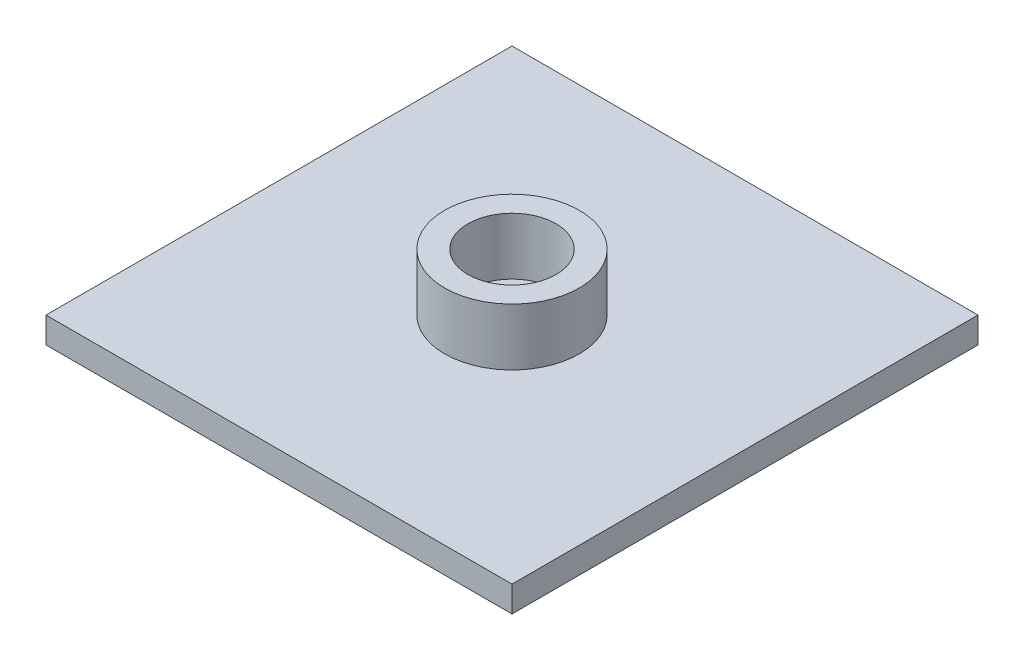
ISO-10303-21;
HEADER;
FILE_DESCRIPTION(('STEP AP214'),'2;1');
FILE_NAME('part.step','',(''),(''),'','','');
FILE_SCHEMA(('AUTOMOTIVE_DESIGN { 1 0 10303 214 1 1 1 1 }'));
ENDSEC;
DATA;
#1=APPLICATION_CONTEXT('core data for automotive mechanical design processes');
#2=APPLICATION_PROTOCOL_DEFINITION('international standard','automotive_design',2000,#1);
#3=PRODUCT_CONTEXT('',#1,'mechanical');
#4=PRODUCT('Part','Part','',(#3));
#5=PRODUCT_RELATED_PRODUCT_CATEGORY('part','',(#4));
#6=PRODUCT_DEFINITION_FORMATION('','',#4);
#7=PRODUCT_DEFINITION_CONTEXT('part definition',#1,'design');
#8=PRODUCT_DEFINITION('design','',#6,#7);
#9=PRODUCT_DEFINITION_SHAPE('','',#8);
#10=(LENGTH_UNIT() NAMED_UNIT(*) SI_UNIT(.MILLI.,.METRE.));
#11=(NAMED_UNIT(*) PLANE_ANGLE_UNIT() SI_UNIT($,.RADIAN.));
#12=(NAMED_UNIT(*) SI_UNIT($,.STERADIAN.) SOLID_ANGLE_UNIT());
#13=UNCERTAINTY_MEASURE_WITH_UNIT(LENGTH_MEASURE(1.E-05),#10,'distance_accuracy_value','');
#14=(GEOMETRIC_REPRESENTATION_CONTEXT(3) GLOBAL_UNCERTAINTY_ASSIGNED_CONTEXT((#13)) GLOBAL_UNIT_ASSIGNED_CONTEXT((#10,
#11,#12)) REPRESENTATION_CONTEXT('',''));
#15=CARTESIAN_POINT('',(0.,0.,0.));
#16=DIRECTION('',(0.,0.,1.));
#17=DIRECTION('',(1.,0.,0.));
#18=AXIS2_PLACEMENT_3D('',#15,#16,#17);
#19=CARTESIAN_POINT('',(0.,6.35,0.));
#20=DIRECTION('',(1.,0.,0.));
#21=DIRECTION('',(0.,0.,-1.));
#22=AXIS2_PLACEMENT_3D('',#19,#20,#21);
#23=PLANE('',#22);
#24=DIRECTION('',(0.,0.,1.));
#25=VECTOR('',#24,1.);
#26=CARTESIAN_POINT('',(0.,0.,0.));
#27=LINE('',#26,#25);
#28=CARTESIAN_POINT('',(0.,0.,-114.3));
#29=VERTEX_POINT('',#28);
#30=CARTESIAN_POINT('',(0.,0.,0.));
#31=VERTEX_POINT('',#30);
#32=EDGE_CURVE('E116',#29,#31,#27,.T.);
#33=ORIENTED_EDGE('',*,*,#32,.T.);
#34=DIRECTION('',(0.,-1.,0.));
#35=VECTOR('',#34,1.);
#36=CARTESIAN_POINT('',(0.,6.35,0.));
#37=LINE('',#36,#35);
#38=CARTESIAN_POINT('',(0.,6.35,0.));
#39=VERTEX_POINT('',#38);
#40=EDGE_CURVE('E48',#39,#31,#37,.T.);
#41=ORIENTED_EDGE('',*,*,#40,.F.);
#42=DIRECTION('',(0.,0.,1.));
#43=VECTOR('',#42,1.);
#44=CARTESIAN_POINT('',(0.,6.35,0.));
#45=LINE('',#44,#43);
#46=CARTESIAN_POINT('',(0.,6.35,-114.3));
#47=VERTEX_POINT('',#46);
#48=EDGE_CURVE('E99',#47,#39,#45,.T.);
#49=ORIENTED_EDGE('',*,*,#48,.F.);
#50=DIRECTION('',(0.,-1.,0.));
#51=VECTOR('',#50,1.);
#52=CARTESIAN_POINT('',(0.,6.35,-114.3));
#53=LINE('',#52,#51);
#54=EDGE_CURVE('E112',#47,#29,#53,.T.);
#55=ORIENTED_EDGE('',*,*,#54,.T.);
#56=EDGE_LOOP('',(#33,#41,#49,#55));
#57=FACE_BOUND('',#56,.T.);
#58=ADVANCED_FACE('F45',(#57),#23,.F.);
#59=CARTESIAN_POINT('',(0.,6.35,0.));
#60=DIRECTION('',(0.,0.,-1.));
#61=DIRECTION('',(-1.,0.,0.));
#62=AXIS2_PLACEMENT_3D('',#59,#60,#61);
#63=PLANE('',#62);
#64=DIRECTION('',(1.,0.,0.));
#65=VECTOR('',#64,1.);
#66=CARTESIAN_POINT('',(0.,0.,0.));
#67=LINE('',#66,#65);
#68=CARTESIAN_POINT('',(114.3,0.,0.));
#69=VERTEX_POINT('',#68);
#70=EDGE_CURVE('E105',#31,#69,#67,.T.);
#71=ORIENTED_EDGE('',*,*,#70,.T.);
#72=DIRECTION('',(0.,-1.,0.));
#73=VECTOR('',#72,1.);
#74=CARTESIAN_POINT('',(114.3,6.35,0.));
#75=LINE('',#74,#73);
#76=CARTESIAN_POINT('',(114.3,6.35,0.));
#77=VERTEX_POINT('',#76);
#78=EDGE_CURVE('E103',#77,#69,#75,.T.);
#79=ORIENTED_EDGE('',*,*,#78,.F.);
#80=DIRECTION('',(1.,0.,0.));
#81=VECTOR('',#80,1.);
#82=CARTESIAN_POINT('',(0.,6.35,0.));
#83=LINE('',#82,#81);
#84=EDGE_CURVE('E94',#39,#77,#83,.T.);
#85=ORIENTED_EDGE('',*,*,#84,.F.);
#86=ORIENTED_EDGE('',*,*,#40,.T.);
#87=EDGE_LOOP('',(#71,#79,#85,#86));
#88=FACE_BOUND('',#87,.T.);
#89=ADVANCED_FACE('F104',(#88),#63,.F.);
#90=CARTESIAN_POINT('',(114.3,6.35,0.));
#91=DIRECTION('',(-1.,0.,0.));
#92=DIRECTION('',(0.,0.,1.));
#93=AXIS2_PLACEMENT_3D('',#90,#91,#92);
#94=PLANE('',#93);
#95=DIRECTION('',(0.,0.,-1.));
#96=VECTOR('',#95,1.);
#97=CARTESIAN_POINT('',(114.3,0.,0.));
#98=LINE('',#97,#96);
#99=CARTESIAN_POINT('',(114.3,0.,-114.3));
#100=VERTEX_POINT('',#99);
#101=EDGE_CURVE('E80',#69,#100,#98,.T.);
#102=ORIENTED_EDGE('',*,*,#101,.T.);
#103=DIRECTION('',(0.,-1.,0.));
#104=VECTOR('',#103,1.);
#105=CARTESIAN_POINT('',(114.3,6.35,-114.3));
#106=LINE('',#105,#104);
#107=CARTESIAN_POINT('',(114.3,6.35,-114.3));
#108=VERTEX_POINT('',#107);
#109=EDGE_CURVE('E107',#108,#100,#106,.T.);
#110=ORIENTED_EDGE('',*,*,#109,.F.);
#111=DIRECTION('',(0.,0.,-1.));
#112=VECTOR('',#111,1.);
#113=CARTESIAN_POINT('',(114.3,6.35,0.));
#114=LINE('',#113,#112);
#115=EDGE_CURVE('E97',#77,#108,#114,.T.);
#116=ORIENTED_EDGE('',*,*,#115,.F.);
#117=ORIENTED_EDGE('',*,*,#78,.T.);
#118=EDGE_LOOP('',(#102,#110,#116,#117));
#119=FACE_BOUND('',#118,.T.);
#120=ADVANCED_FACE('F108',(#119),#94,.F.);
#121=CARTESIAN_POINT('',(0.,6.35,-114.3));
#122=DIRECTION('',(0.,0.,1.));
#123=DIRECTION('',(1.,0.,0.));
#124=AXIS2_PLACEMENT_3D('',#121,#122,#123);
#125=PLANE('',#124);
#126=DIRECTION('',(-1.,0.,0.));
#127=VECTOR('',#126,1.);
#128=CARTESIAN_POINT('',(0.,0.,-114.3));
#129=LINE('',#128,#127);
#130=EDGE_CURVE('E86',#100,#29,#129,.T.);
#131=ORIENTED_EDGE('',*,*,#130,.T.);
#132=ORIENTED_EDGE('',*,*,#54,.F.);
#133=DIRECTION('',(-1.,0.,0.));
#134=VECTOR('',#133,1.);
#135=CARTESIAN_POINT('',(0.,6.35,-114.3));
#136=LINE('',#135,#134);
#137=EDGE_CURVE('E63',#108,#47,#136,.T.);
#138=ORIENTED_EDGE('',*,*,#137,.F.);
#139=ORIENTED_EDGE('',*,*,#109,.T.);
#140=EDGE_LOOP('',(#131,#132,#138,#139));
#141=FACE_BOUND('',#140,.T.);
#142=ADVANCED_FACE('F130',(#141),#125,.F.);
#143=CARTESIAN_POINT('',(0.,6.35,0.));
#144=DIRECTION('',(0.,-1.,0.));
#145=DIRECTION('',(0.,0.,-1.));
#146=AXIS2_PLACEMENT_3D('',#143,#144,#145);
#147=PLANE('',#146);
#148=CARTESIAN_POINT('',(57.15,6.35,-57.15));
#149=DIRECTION('',(0.,1.,0.));
#150=DIRECTION('',(0.,0.,1.));
#151=AXIS2_PLACEMENT_3D('',#148,#149,#150);
#152=CIRCLE('',#151,16.51);
#153=CARTESIAN_POINT('',(57.15,6.35,-40.64));
#154=VERTEX_POINT('',#153);
#155=EDGE_CURVE('E11',#154,#154,#152,.T.);
#156=ORIENTED_EDGE('',*,*,#155,.F.);
#157=EDGE_LOOP('',(#156));
#158=FACE_BOUND('',#157,.T.);
#159=ORIENTED_EDGE('',*,*,#48,.T.);
#160=ORIENTED_EDGE('',*,*,#84,.T.);
#161=ORIENTED_EDGE('',*,*,#115,.T.);
#162=ORIENTED_EDGE('',*,*,#137,.T.);
#163=EDGE_LOOP('',(#159,#160,#161,#162));
#164=FACE_BOUND('',#163,.T.);
#165=ADVANCED_FACE('F95',(#158,#164),#147,.F.);
#166=CARTESIAN_POINT('',(0.,0.,0.));
#167=DIRECTION('',(0.,-1.,0.));
#168=DIRECTION('',(0.,0.,-1.));
#169=AXIS2_PLACEMENT_3D('',#166,#167,#168);
#170=PLANE('',#169);
#171=ORIENTED_EDGE('',*,*,#32,.F.);
#172=ORIENTED_EDGE('',*,*,#130,.F.);
#173=ORIENTED_EDGE('',*,*,#101,.F.);
#174=ORIENTED_EDGE('',*,*,#70,.F.);
#175=EDGE_LOOP('',(#171,#172,#173,#174));
#176=FACE_BOUND('',#175,.T.);
#177=ADVANCED_FACE('F133',(#176),#170,.T.);
#178=CARTESIAN_POINT('',(57.15,20.35,-57.15));
#179=DIRECTION('',(0.,-1.,0.));
#180=DIRECTION('',(0.,0.,-1.));
#181=AXIS2_PLACEMENT_3D('',#178,#179,#180);
#182=CYLINDRICAL_SURFACE('',#181,16.51);
#183=CARTESIAN_POINT('',(57.15,20.35,-57.15));
#184=DIRECTION('',(0.,1.,0.));
#185=DIRECTION('',(0.,0.,1.));
#186=AXIS2_PLACEMENT_3D('',#183,#184,#185);
#187=CIRCLE('',#186,16.51);
#188=CARTESIAN_POINT('',(57.15,20.35,-40.64));
#189=VERTEX_POINT('',#188);
#190=EDGE_CURVE('E120',#189,#189,#187,.T.);
#191=ORIENTED_EDGE('',*,*,#190,.F.);
#192=EDGE_LOOP('',(#191));
#193=FACE_BOUND('',#192,.T.);
#194=ORIENTED_EDGE('',*,*,#155,.T.);
#195=EDGE_LOOP('',(#194));
#196=FACE_BOUND('',#195,.T.);
#197=ADVANCED_FACE('F160',(#193,#196),#182,.T.);
#198=CARTESIAN_POINT('',(57.15,20.35,-57.15));
#199=DIRECTION('',(0.,1.,0.));
#200=DIRECTION('',(0.,0.,1.));
#201=AXIS2_PLACEMENT_3D('',#198,#199,#200);
#202=PLANE('',#201);
#203=CARTESIAN_POINT('',(57.15,20.35,-57.15));
#204=DIRECTION('',(0.,1.,0.));
#205=DIRECTION('',(0.,0.,1.));
#206=AXIS2_PLACEMENT_3D('',#203,#204,#205);
#207=CIRCLE('',#206,10.8);
#208=CARTESIAN_POINT('',(57.15,20.35,-46.35));
#209=VERTEX_POINT('',#208);
#210=EDGE_CURVE('E141',#209,#209,#207,.T.);
#211=ORIENTED_EDGE('',*,*,#210,.F.);
#212=EDGE_LOOP('',(#211));
#213=FACE_BOUND('',#212,.T.);
#214=ORIENTED_EDGE('',*,*,#190,.T.);
#215=EDGE_LOOP('',(#214));
#216=FACE_BOUND('',#215,.T.);
#217=ADVANCED_FACE('F154',(#213,#216),#202,.T.);
#218=CARTESIAN_POINT('',(57.15,6.35,-57.15));
#219=DIRECTION('',(0.,1.,0.));
#220=DIRECTION('',(0.,0.,1.));
#221=AXIS2_PLACEMENT_3D('',#218,#219,#220);
#222=CYLINDRICAL_SURFACE('',#221,10.8);
#223=CARTESIAN_POINT('',(57.15,6.35,-57.15));
#224=DIRECTION('',(0.,1.,0.));
#225=DIRECTION('',(0.,0.,1.));
#226=AXIS2_PLACEMENT_3D('',#223,#224,#225);
#227=CIRCLE('',#226,10.8);
#228=CARTESIAN_POINT('',(57.15,6.35,-46.35));
#229=VERTEX_POINT('',#228);
#230=EDGE_CURVE('E140',#229,#229,#227,.T.);
#231=ORIENTED_EDGE('',*,*,#230,.F.);
#232=EDGE_LOOP('',(#231));
#233=FACE_BOUND('',#232,.T.);
#234=ORIENTED_EDGE('',*,*,#210,.T.);
#235=EDGE_LOOP('',(#234));
#236=FACE_BOUND('',#235,.T.);
#237=ADVANCED_FACE('F151',(#233,#236),#222,.F.);
#238=CARTESIAN_POINT('',(57.15,6.35,-57.15));
#239=DIRECTION('',(0.,1.,0.));
#240=DIRECTION('',(0.,0.,1.));
#241=AXIS2_PLACEMENT_3D('',#238,#239,#240);
#242=PLANE('',#241);
#243=ORIENTED_EDGE('',*,*,#230,.T.);
#244=EDGE_LOOP('',(#243));
#245=FACE_BOUND('',#244,.T.);
#246=ADVANCED_FACE('F149',(#245),#242,.T.);
#247=CLOSED_SHELL('',(#58,#89,#120,#142,#165,#177,#197,#217,#237,#246));
#248=MANIFOLD_SOLID_BREP('B2',#247);
#249=ADVANCED_BREP_SHAPE_REPRESENTATION('',(#18,#248),#14);
#250=SHAPE_DEFINITION_REPRESENTATION(#9,#249);
ENDSEC;
END-ISO-10303-21;
